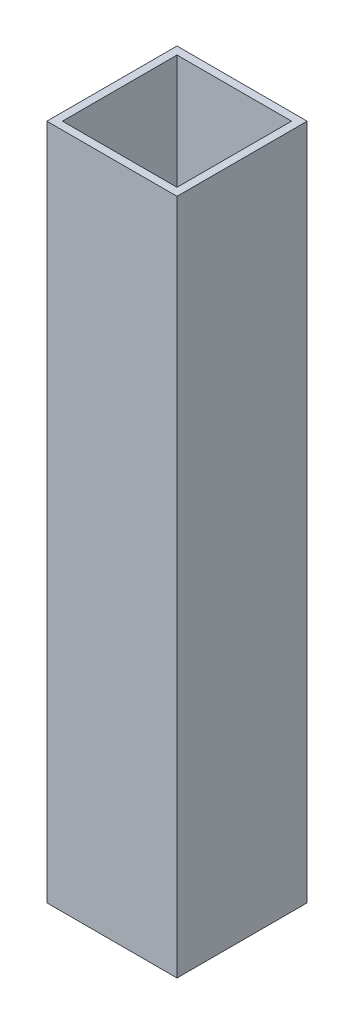
ISO-10303-21;
HEADER;
FILE_DESCRIPTION(('STEP AP214'),'2;1');
FILE_NAME('part.step','',(''),(''),'','','');
FILE_SCHEMA(('AUTOMOTIVE_DESIGN { 1 0 10303 214 1 1 1 1 }'));
ENDSEC;
DATA;
#1=APPLICATION_CONTEXT('core data for automotive mechanical design processes');
#2=APPLICATION_PROTOCOL_DEFINITION('international standard','automotive_design',2000,#1);
#3=PRODUCT_CONTEXT('',#1,'mechanical');
#4=PRODUCT('Part','Part','',(#3));
#5=PRODUCT_RELATED_PRODUCT_CATEGORY('part','',(#4));
#6=PRODUCT_DEFINITION_FORMATION('','',#4);
#7=PRODUCT_DEFINITION_CONTEXT('part definition',#1,'design');
#8=PRODUCT_DEFINITION('design','',#6,#7);
#9=PRODUCT_DEFINITION_SHAPE('','',#8);
#10=(LENGTH_UNIT() NAMED_UNIT(*) SI_UNIT(.MILLI.,.METRE.));
#11=(NAMED_UNIT(*) PLANE_ANGLE_UNIT() SI_UNIT($,.RADIAN.));
#12=(NAMED_UNIT(*) SI_UNIT($,.STERADIAN.) SOLID_ANGLE_UNIT());
#13=UNCERTAINTY_MEASURE_WITH_UNIT(LENGTH_MEASURE(1.E-05),#10,'distance_accuracy_value','');
#14=(GEOMETRIC_REPRESENTATION_CONTEXT(3) GLOBAL_UNCERTAINTY_ASSIGNED_CONTEXT((#13)) GLOBAL_UNIT_ASSIGNED_CONTEXT((#10,
#11,#12)) REPRESENTATION_CONTEXT('',''));
#15=CARTESIAN_POINT('',(0.,0.,0.));
#16=DIRECTION('',(0.,0.,1.));
#17=DIRECTION('',(1.,0.,0.));
#18=AXIS2_PLACEMENT_3D('',#15,#16,#17);
#19=CARTESIAN_POINT('',(12.5,-65.,-12.5));
#20=DIRECTION('',(1.,0.,0.));
#21=DIRECTION('',(0.,0.,-1.));
#22=AXIS2_PLACEMENT_3D('',#19,#20,#21);
#23=PLANE('',#22);
#24=DIRECTION('',(0.,1.,0.));
#25=VECTOR('',#24,1.);
#26=CARTESIAN_POINT('',(12.5,-65.,-12.5));
#27=LINE('',#26,#25);
#28=CARTESIAN_POINT('',(12.5,-65.,-12.5));
#29=VERTEX_POINT('',#28);
#30=CARTESIAN_POINT('',(12.5,65.,-12.5));
#31=VERTEX_POINT('',#30);
#32=EDGE_CURVE('E38',#29,#31,#27,.T.);
#33=ORIENTED_EDGE('',*,*,#32,.T.);
#34=DIRECTION('',(0.,0.,-1.));
#35=VECTOR('',#34,1.);
#36=CARTESIAN_POINT('',(12.5,65.,-12.5));
#37=LINE('',#36,#35);
#38=CARTESIAN_POINT('',(12.5,65.,12.5));
#39=VERTEX_POINT('',#38);
#40=EDGE_CURVE('E130',#39,#31,#37,.T.);
#41=ORIENTED_EDGE('',*,*,#40,.F.);
#42=DIRECTION('',(0.,1.,0.));
#43=VECTOR('',#42,1.);
#44=CARTESIAN_POINT('',(12.5,-65.,12.5));
#45=LINE('',#44,#43);
#46=CARTESIAN_POINT('',(12.5,-65.,12.5));
#47=VERTEX_POINT('',#46);
#48=EDGE_CURVE('E11',#47,#39,#45,.T.);
#49=ORIENTED_EDGE('',*,*,#48,.F.);
#50=DIRECTION('',(0.,0.,-1.));
#51=VECTOR('',#50,1.);
#52=CARTESIAN_POINT('',(12.5,-65.,-12.5));
#53=LINE('',#52,#51);
#54=EDGE_CURVE('E149',#47,#29,#53,.T.);
#55=ORIENTED_EDGE('',*,*,#54,.T.);
#56=EDGE_LOOP('',(#33,#41,#49,#55));
#57=FACE_BOUND('',#56,.T.);
#58=ADVANCED_FACE('F35',(#57),#23,.T.);
#59=CARTESIAN_POINT('',(-12.5,-65.,12.5));
#60=DIRECTION('',(0.,0.,1.));
#61=DIRECTION('',(1.,0.,0.));
#62=AXIS2_PLACEMENT_3D('',#59,#60,#61);
#63=PLANE('',#62);
#64=ORIENTED_EDGE('',*,*,#48,.T.);
#65=DIRECTION('',(1.,0.,0.));
#66=VECTOR('',#65,1.);
#67=CARTESIAN_POINT('',(-12.5,65.,12.5));
#68=LINE('',#67,#66);
#69=CARTESIAN_POINT('',(-12.5,65.,12.5));
#70=VERTEX_POINT('',#69);
#71=EDGE_CURVE('E139',#70,#39,#68,.T.);
#72=ORIENTED_EDGE('',*,*,#71,.F.);
#73=DIRECTION('',(0.,1.,0.));
#74=VECTOR('',#73,1.);
#75=CARTESIAN_POINT('',(-12.5,-65.,12.5));
#76=LINE('',#75,#74);
#77=CARTESIAN_POINT('',(-12.5,-65.,12.5));
#78=VERTEX_POINT('',#77);
#79=EDGE_CURVE('E43',#78,#70,#76,.T.);
#80=ORIENTED_EDGE('',*,*,#79,.F.);
#81=DIRECTION('',(1.,0.,0.));
#82=VECTOR('',#81,1.);
#83=CARTESIAN_POINT('',(-12.5,-65.,12.5));
#84=LINE('',#83,#82);
#85=EDGE_CURVE('E160',#78,#47,#84,.T.);
#86=ORIENTED_EDGE('',*,*,#85,.T.);
#87=EDGE_LOOP('',(#64,#72,#80,#86));
#88=FACE_BOUND('',#87,.T.);
#89=ADVANCED_FACE('F172',(#88),#63,.T.);
#90=CARTESIAN_POINT('',(-12.5,-65.,-12.5));
#91=DIRECTION('',(-1.,0.,0.));
#92=DIRECTION('',(0.,0.,1.));
#93=AXIS2_PLACEMENT_3D('',#90,#91,#92);
#94=PLANE('',#93);
#95=ORIENTED_EDGE('',*,*,#79,.T.);
#96=DIRECTION('',(0.,0.,1.));
#97=VECTOR('',#96,1.);
#98=CARTESIAN_POINT('',(-12.5,65.,-12.5));
#99=LINE('',#98,#97);
#100=CARTESIAN_POINT('',(-12.5,65.,-12.5));
#101=VERTEX_POINT('',#100);
#102=EDGE_CURVE('E136',#101,#70,#99,.T.);
#103=ORIENTED_EDGE('',*,*,#102,.F.);
#104=DIRECTION('',(0.,1.,0.));
#105=VECTOR('',#104,1.);
#106=CARTESIAN_POINT('',(-12.5,-65.,-12.5));
#107=LINE('',#106,#105);
#108=CARTESIAN_POINT('',(-12.5,-65.,-12.5));
#109=VERTEX_POINT('',#108);
#110=EDGE_CURVE('E163',#109,#101,#107,.T.);
#111=ORIENTED_EDGE('',*,*,#110,.F.);
#112=DIRECTION('',(0.,0.,1.));
#113=VECTOR('',#112,1.);
#114=CARTESIAN_POINT('',(-12.5,-65.,-12.5));
#115=LINE('',#114,#113);
#116=EDGE_CURVE('E157',#109,#78,#115,.T.);
#117=ORIENTED_EDGE('',*,*,#116,.T.);
#118=EDGE_LOOP('',(#95,#103,#111,#117));
#119=FACE_BOUND('',#118,.T.);
#120=ADVANCED_FACE('F178',(#119),#94,.T.);
#121=CARTESIAN_POINT('',(-12.5,-65.,-12.5));
#122=DIRECTION('',(0.,0.,-1.));
#123=DIRECTION('',(-1.,0.,0.));
#124=AXIS2_PLACEMENT_3D('',#121,#122,#123);
#125=PLANE('',#124);
#126=ORIENTED_EDGE('',*,*,#110,.T.);
#127=DIRECTION('',(-1.,0.,0.));
#128=VECTOR('',#127,1.);
#129=CARTESIAN_POINT('',(-12.5,65.,-12.5));
#130=LINE('',#129,#128);
#131=EDGE_CURVE('E133',#31,#101,#130,.T.);
#132=ORIENTED_EDGE('',*,*,#131,.F.);
#133=ORIENTED_EDGE('',*,*,#32,.F.);
#134=DIRECTION('',(-1.,0.,0.));
#135=VECTOR('',#134,1.);
#136=CARTESIAN_POINT('',(-12.5,-65.,-12.5));
#137=LINE('',#136,#135);
#138=EDGE_CURVE('E154',#29,#109,#137,.T.);
#139=ORIENTED_EDGE('',*,*,#138,.T.);
#140=EDGE_LOOP('',(#126,#132,#133,#139));
#141=FACE_BOUND('',#140,.T.);
#142=ADVANCED_FACE('F167',(#141),#125,.T.);
#143=CARTESIAN_POINT('',(0.,-65.,0.));
#144=DIRECTION('',(0.,1.,0.));
#145=DIRECTION('',(0.,0.,1.));
#146=AXIS2_PLACEMENT_3D('',#143,#144,#145);
#147=PLANE('',#146);
#148=DIRECTION('',(0.,0.,-1.));
#149=VECTOR('',#148,1.);
#150=CARTESIAN_POINT('',(11.,-65.,-11.));
#151=LINE('',#150,#149);
#152=CARTESIAN_POINT('',(11.,-65.,11.));
#153=VERTEX_POINT('',#152);
#154=CARTESIAN_POINT('',(11.,-65.,-11.));
#155=VERTEX_POINT('',#154);
#156=EDGE_CURVE('E112',#153,#155,#151,.T.);
#157=ORIENTED_EDGE('',*,*,#156,.T.);
#158=DIRECTION('',(-1.,0.,0.));
#159=VECTOR('',#158,1.);
#160=CARTESIAN_POINT('',(-11.,-65.,-11.));
#161=LINE('',#160,#159);
#162=CARTESIAN_POINT('',(-11.,-65.,-11.));
#163=VERTEX_POINT('',#162);
#164=EDGE_CURVE('E142',#155,#163,#161,.T.);
#165=ORIENTED_EDGE('',*,*,#164,.T.);
#166=DIRECTION('',(0.,0.,1.));
#167=VECTOR('',#166,1.);
#168=CARTESIAN_POINT('',(-11.,-65.,-11.));
#169=LINE('',#168,#167);
#170=CARTESIAN_POINT('',(-11.,-65.,11.));
#171=VERTEX_POINT('',#170);
#172=EDGE_CURVE('E107',#163,#171,#169,.T.);
#173=ORIENTED_EDGE('',*,*,#172,.T.);
#174=DIRECTION('',(1.,0.,0.));
#175=VECTOR('',#174,1.);
#176=CARTESIAN_POINT('',(-11.,-65.,11.));
#177=LINE('',#176,#175);
#178=EDGE_CURVE('E51',#171,#153,#177,.T.);
#179=ORIENTED_EDGE('',*,*,#178,.T.);
#180=EDGE_LOOP('',(#157,#165,#173,#179));
#181=FACE_BOUND('',#180,.T.);
#182=ORIENTED_EDGE('',*,*,#54,.F.);
#183=ORIENTED_EDGE('',*,*,#85,.F.);
#184=ORIENTED_EDGE('',*,*,#116,.F.);
#185=ORIENTED_EDGE('',*,*,#138,.F.);
#186=EDGE_LOOP('',(#182,#183,#184,#185));
#187=FACE_BOUND('',#186,.T.);
#188=ADVANCED_FACE('F176',(#181,#187),#147,.F.);
#189=CARTESIAN_POINT('',(-11.,-65.,-11.));
#190=DIRECTION('',(0.,0.,-1.));
#191=DIRECTION('',(-1.,0.,0.));
#192=AXIS2_PLACEMENT_3D('',#189,#190,#191);
#193=PLANE('',#192);
#194=DIRECTION('',(0.,1.,0.));
#195=VECTOR('',#194,1.);
#196=CARTESIAN_POINT('',(11.,-65.,-11.));
#197=LINE('',#196,#195);
#198=CARTESIAN_POINT('',(11.,65.,-11.));
#199=VERTEX_POINT('',#198);
#200=EDGE_CURVE('E117',#155,#199,#197,.T.);
#201=ORIENTED_EDGE('',*,*,#200,.T.);
#202=DIRECTION('',(-1.,0.,0.));
#203=VECTOR('',#202,1.);
#204=CARTESIAN_POINT('',(-11.,65.,-11.));
#205=LINE('',#204,#203);
#206=CARTESIAN_POINT('',(-11.,65.,-11.));
#207=VERTEX_POINT('',#206);
#208=EDGE_CURVE('E115',#199,#207,#205,.T.);
#209=ORIENTED_EDGE('',*,*,#208,.T.);
#210=DIRECTION('',(0.,1.,0.));
#211=VECTOR('',#210,1.);
#212=CARTESIAN_POINT('',(-11.,-65.,-11.));
#213=LINE('',#212,#211);
#214=EDGE_CURVE('E100',#163,#207,#213,.T.);
#215=ORIENTED_EDGE('',*,*,#214,.F.);
#216=ORIENTED_EDGE('',*,*,#164,.F.);
#217=EDGE_LOOP('',(#201,#209,#215,#216));
#218=FACE_BOUND('',#217,.T.);
#219=ADVANCED_FACE('F116',(#218),#193,.F.);
#220=CARTESIAN_POINT('',(11.,-65.,-11.));
#221=DIRECTION('',(1.,0.,0.));
#222=DIRECTION('',(0.,0.,-1.));
#223=AXIS2_PLACEMENT_3D('',#220,#221,#222);
#224=PLANE('',#223);
#225=DIRECTION('',(0.,1.,0.));
#226=VECTOR('',#225,1.);
#227=CARTESIAN_POINT('',(11.,-65.,11.));
#228=LINE('',#227,#226);
#229=CARTESIAN_POINT('',(11.,65.,11.));
#230=VERTEX_POINT('',#229);
#231=EDGE_CURVE('E150',#153,#230,#228,.T.);
#232=ORIENTED_EDGE('',*,*,#231,.T.);
#233=DIRECTION('',(0.,0.,-1.));
#234=VECTOR('',#233,1.);
#235=CARTESIAN_POINT('',(11.,65.,-11.));
#236=LINE('',#235,#234);
#237=EDGE_CURVE('E126',#230,#199,#236,.T.);
#238=ORIENTED_EDGE('',*,*,#237,.T.);
#239=ORIENTED_EDGE('',*,*,#200,.F.);
#240=ORIENTED_EDGE('',*,*,#156,.F.);
#241=EDGE_LOOP('',(#232,#238,#239,#240));
#242=FACE_BOUND('',#241,.T.);
#243=ADVANCED_FACE('F221',(#242),#224,.F.);
#244=CARTESIAN_POINT('',(-11.,-65.,11.));
#245=DIRECTION('',(0.,0.,1.));
#246=DIRECTION('',(1.,0.,0.));
#247=AXIS2_PLACEMENT_3D('',#244,#245,#246);
#248=PLANE('',#247);
#249=DIRECTION('',(0.,1.,0.));
#250=VECTOR('',#249,1.);
#251=CARTESIAN_POINT('',(-11.,-65.,11.));
#252=LINE('',#251,#250);
#253=CARTESIAN_POINT('',(-11.,65.,11.));
#254=VERTEX_POINT('',#253);
#255=EDGE_CURVE('E111',#171,#254,#252,.T.);
#256=ORIENTED_EDGE('',*,*,#255,.T.);
#257=DIRECTION('',(1.,0.,0.));
#258=VECTOR('',#257,1.);
#259=CARTESIAN_POINT('',(-11.,65.,11.));
#260=LINE('',#259,#258);
#261=EDGE_CURVE('E124',#254,#230,#260,.T.);
#262=ORIENTED_EDGE('',*,*,#261,.T.);
#263=ORIENTED_EDGE('',*,*,#231,.F.);
#264=ORIENTED_EDGE('',*,*,#178,.F.);
#265=EDGE_LOOP('',(#256,#262,#263,#264));
#266=FACE_BOUND('',#265,.T.);
#267=ADVANCED_FACE('F230',(#266),#248,.F.);
#268=CARTESIAN_POINT('',(-11.,-65.,-11.));
#269=DIRECTION('',(-1.,0.,0.));
#270=DIRECTION('',(0.,0.,1.));
#271=AXIS2_PLACEMENT_3D('',#268,#269,#270);
#272=PLANE('',#271);
#273=ORIENTED_EDGE('',*,*,#214,.T.);
#274=DIRECTION('',(0.,0.,1.));
#275=VECTOR('',#274,1.);
#276=CARTESIAN_POINT('',(-11.,65.,-11.));
#277=LINE('',#276,#275);
#278=EDGE_CURVE('E104',#207,#254,#277,.T.);
#279=ORIENTED_EDGE('',*,*,#278,.T.);
#280=ORIENTED_EDGE('',*,*,#255,.F.);
#281=ORIENTED_EDGE('',*,*,#172,.F.);
#282=EDGE_LOOP('',(#273,#279,#280,#281));
#283=FACE_BOUND('',#282,.T.);
#284=ADVANCED_FACE('F102',(#283),#272,.F.);
#285=CARTESIAN_POINT('',(0.,65.,0.));
#286=DIRECTION('',(0.,1.,0.));
#287=DIRECTION('',(0.,0.,1.));
#288=AXIS2_PLACEMENT_3D('',#285,#286,#287);
#289=PLANE('',#288);
#290=ORIENTED_EDGE('',*,*,#40,.T.);
#291=ORIENTED_EDGE('',*,*,#131,.T.);
#292=ORIENTED_EDGE('',*,*,#102,.T.);
#293=ORIENTED_EDGE('',*,*,#71,.T.);
#294=EDGE_LOOP('',(#290,#291,#292,#293));
#295=FACE_BOUND('',#294,.T.);
#296=ORIENTED_EDGE('',*,*,#278,.F.);
#297=ORIENTED_EDGE('',*,*,#208,.F.);
#298=ORIENTED_EDGE('',*,*,#237,.F.);
#299=ORIENTED_EDGE('',*,*,#261,.F.);
#300=EDGE_LOOP('',(#296,#297,#298,#299));
#301=FACE_BOUND('',#300,.T.);
#302=ADVANCED_FACE('F122',(#295,#301),#289,.T.);
#303=CLOSED_SHELL('',(#58,#89,#120,#142,#188,#219,#243,#267,#284,#302));
#304=MANIFOLD_SOLID_BREP('B2',#303);
#305=ADVANCED_BREP_SHAPE_REPRESENTATION('',(#18,#304),#14);
#306=SHAPE_DEFINITION_REPRESENTATION(#9,#305);
ENDSEC;
END-ISO-10303-21;
